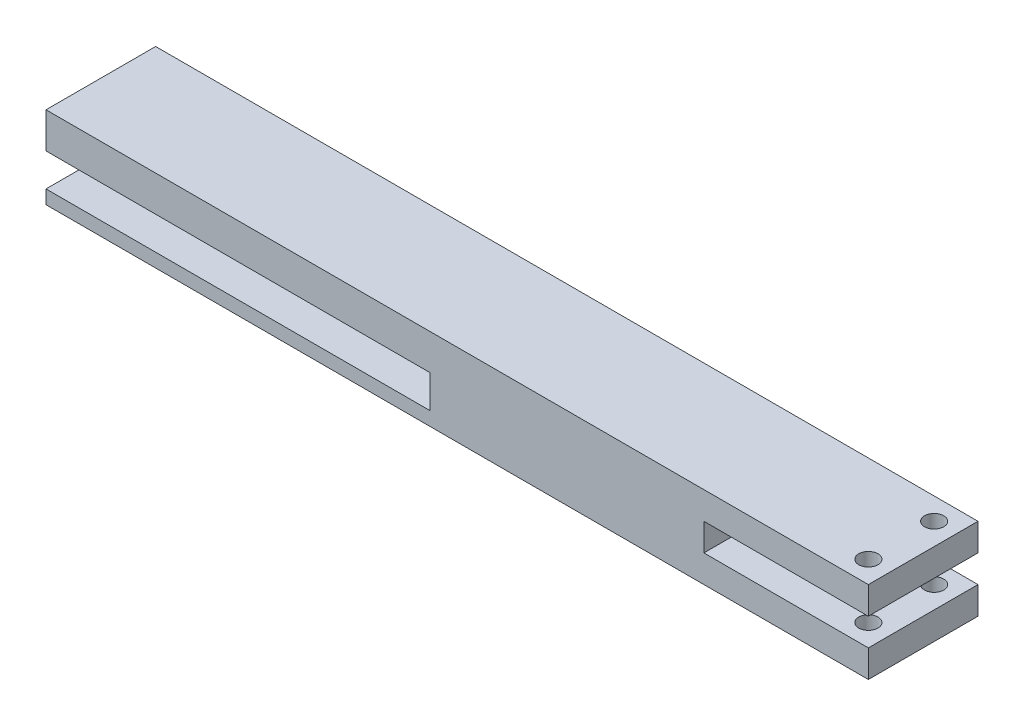
ISO-10303-21;
HEADER;
FILE_DESCRIPTION(('STEP AP214'),'2;1');
FILE_NAME('part.step','',(''),(''),'','','');
FILE_SCHEMA(('AUTOMOTIVE_DESIGN { 1 0 10303 214 1 1 1 1 }'));
ENDSEC;
DATA;
#1=APPLICATION_CONTEXT('core data for automotive mechanical design processes');
#2=APPLICATION_PROTOCOL_DEFINITION('international standard','automotive_design',2000,#1);
#3=PRODUCT_CONTEXT('',#1,'mechanical');
#4=PRODUCT('Part','Part','',(#3));
#5=PRODUCT_RELATED_PRODUCT_CATEGORY('part','',(#4));
#6=PRODUCT_DEFINITION_FORMATION('','',#4);
#7=PRODUCT_DEFINITION_CONTEXT('part definition',#1,'design');
#8=PRODUCT_DEFINITION('design','',#6,#7);
#9=PRODUCT_DEFINITION_SHAPE('','',#8);
#10=(LENGTH_UNIT() NAMED_UNIT(*) SI_UNIT(.MILLI.,.METRE.));
#11=(NAMED_UNIT(*) PLANE_ANGLE_UNIT() SI_UNIT($,.RADIAN.));
#12=(NAMED_UNIT(*) SI_UNIT($,.STERADIAN.) SOLID_ANGLE_UNIT());
#13=UNCERTAINTY_MEASURE_WITH_UNIT(LENGTH_MEASURE(1.E-05),#10,'distance_accuracy_value','');
#14=(GEOMETRIC_REPRESENTATION_CONTEXT(3) GLOBAL_UNCERTAINTY_ASSIGNED_CONTEXT((#13)) GLOBAL_UNIT_ASSIGNED_CONTEXT((#10,
#11,#12)) REPRESENTATION_CONTEXT('',''));
#15=CARTESIAN_POINT('',(0.,0.,0.));
#16=DIRECTION('',(0.,0.,1.));
#17=DIRECTION('',(1.,0.,0.));
#18=AXIS2_PLACEMENT_3D('',#15,#16,#17);
#19=CARTESIAN_POINT('',(68.8,-15.,-10.));
#20=DIRECTION('',(1.,0.,0.));
#21=DIRECTION('',(0.,0.,-1.));
#22=AXIS2_PLACEMENT_3D('',#19,#20,#21);
#23=PLANE('',#22);
#24=DIRECTION('',(0.,0.,1.));
#25=VECTOR('',#24,1.);
#26=CARTESIAN_POINT('',(68.8,-10.,-10.));
#27=LINE('',#26,#25);
#28=CARTESIAN_POINT('',(68.8,-10.,-10.));
#29=VERTEX_POINT('',#28);
#30=CARTESIAN_POINT('',(68.8,-10.,10.));
#31=VERTEX_POINT('',#30);
#32=EDGE_CURVE('E192',#29,#31,#27,.T.);
#33=ORIENTED_EDGE('',*,*,#32,.T.);
#34=DIRECTION('',(0.,1.,0.));
#35=VECTOR('',#34,1.);
#36=CARTESIAN_POINT('',(68.8,-15.,10.));
#37=LINE('',#36,#35);
#38=CARTESIAN_POINT('',(68.8,-15.,10.));
#39=VERTEX_POINT('',#38);
#40=EDGE_CURVE('E149',#39,#31,#37,.T.);
#41=ORIENTED_EDGE('',*,*,#40,.F.);
#42=DIRECTION('',(0.,0.,-1.));
#43=VECTOR('',#42,1.);
#44=CARTESIAN_POINT('',(68.8,-15.,-10.));
#45=LINE('',#44,#43);
#46=CARTESIAN_POINT('',(68.8,-15.,-10.));
#47=VERTEX_POINT('',#46);
#48=EDGE_CURVE('E229',#39,#47,#45,.T.);
#49=ORIENTED_EDGE('',*,*,#48,.T.);
#50=DIRECTION('',(0.,1.,0.));
#51=VECTOR('',#50,1.);
#52=CARTESIAN_POINT('',(68.8,-15.,-10.));
#53=LINE('',#52,#51);
#54=EDGE_CURVE('E148',#47,#29,#53,.T.);
#55=ORIENTED_EDGE('',*,*,#54,.T.);
#56=EDGE_LOOP('',(#33,#41,#49,#55));
#57=FACE_BOUND('',#56,.T.);
#58=ADVANCED_FACE('F33',(#57),#23,.T.);
#59=CARTESIAN_POINT('',(-81.2,-15.,10.));
#60=DIRECTION('',(-1.,0.,0.));
#61=DIRECTION('',(0.,0.,1.));
#62=AXIS2_PLACEMENT_3D('',#59,#60,#61);
#63=PLANE('',#62);
#64=DIRECTION('',(0.,0.,1.));
#65=VECTOR('',#64,1.);
#66=CARTESIAN_POINT('',(-81.2,-6.5,-10.));
#67=LINE('',#66,#65);
#68=CARTESIAN_POINT('',(-81.2,-6.5,-10.));
#69=VERTEX_POINT('',#68);
#70=CARTESIAN_POINT('',(-81.2,-6.5,10.));
#71=VERTEX_POINT('',#70);
#72=EDGE_CURVE('E214',#69,#71,#67,.T.);
#73=ORIENTED_EDGE('',*,*,#72,.T.);
#74=DIRECTION('',(0.,1.,0.));
#75=VECTOR('',#74,1.);
#76=CARTESIAN_POINT('',(-81.2,-15.,10.));
#77=LINE('',#76,#75);
#78=CARTESIAN_POINT('',(-81.2,0.,10.));
#79=VERTEX_POINT('',#78);
#80=EDGE_CURVE('E158',#71,#79,#77,.T.);
#81=ORIENTED_EDGE('',*,*,#80,.T.);
#82=DIRECTION('',(0.,0.,1.));
#83=VECTOR('',#82,1.);
#84=CARTESIAN_POINT('',(-81.2,0.,10.));
#85=LINE('',#84,#83);
#86=CARTESIAN_POINT('',(-81.2,0.,-10.));
#87=VERTEX_POINT('',#86);
#88=EDGE_CURVE('E217',#87,#79,#85,.T.);
#89=ORIENTED_EDGE('',*,*,#88,.F.);
#90=DIRECTION('',(0.,1.,0.));
#91=VECTOR('',#90,1.);
#92=CARTESIAN_POINT('',(-81.2,-15.,-10.));
#93=LINE('',#92,#91);
#94=EDGE_CURVE('E42',#69,#87,#93,.T.);
#95=ORIENTED_EDGE('',*,*,#94,.F.);
#96=EDGE_LOOP('',(#73,#81,#89,#95));
#97=FACE_BOUND('',#96,.T.);
#98=ADVANCED_FACE('F272',(#97),#63,.T.);
#99=DIRECTION('',(0.,0.,1.));
#100=VECTOR('',#99,1.);
#101=CARTESIAN_POINT('',(-81.2,-12.5,-10.));
#102=LINE('',#101,#100);
#103=CARTESIAN_POINT('',(-81.2,-12.5,-10.));
#104=VERTEX_POINT('',#103);
#105=CARTESIAN_POINT('',(-81.2,-12.5,10.));
#106=VERTEX_POINT('',#105);
#107=EDGE_CURVE('E58',#104,#106,#102,.T.);
#108=ORIENTED_EDGE('',*,*,#107,.F.);
#109=CARTESIAN_POINT('',(-81.2,-15.,-10.));
#110=VERTEX_POINT('',#109);
#111=EDGE_CURVE('E11',#110,#104,#93,.T.);
#112=ORIENTED_EDGE('',*,*,#111,.F.);
#113=DIRECTION('',(0.,0.,1.));
#114=VECTOR('',#113,1.);
#115=CARTESIAN_POINT('',(-81.2,-15.,10.));
#116=LINE('',#115,#114);
#117=CARTESIAN_POINT('',(-81.2,-15.,10.));
#118=VERTEX_POINT('',#117);
#119=EDGE_CURVE('E223',#110,#118,#116,.T.);
#120=ORIENTED_EDGE('',*,*,#119,.T.);
#121=EDGE_CURVE('E156',#118,#106,#77,.T.);
#122=ORIENTED_EDGE('',*,*,#121,.T.);
#123=EDGE_LOOP('',(#108,#112,#120,#122));
#124=FACE_BOUND('',#123,.T.);
#125=ADVANCED_FACE('F35',(#124),#63,.T.);
#126=CARTESIAN_POINT('',(-81.2,-15.,-10.));
#127=DIRECTION('',(0.,0.,-1.));
#128=DIRECTION('',(-1.,0.,0.));
#129=AXIS2_PLACEMENT_3D('',#126,#127,#128);
#130=PLANE('',#129);
#131=DIRECTION('',(1.,0.,0.));
#132=VECTOR('',#131,1.);
#133=CARTESIAN_POINT('',(68.8,-10.,-10.));
#134=LINE('',#133,#132);
#135=CARTESIAN_POINT('',(38.8,-10.,-10.));
#136=VERTEX_POINT('',#135);
#137=EDGE_CURVE('E141',#136,#29,#134,.T.);
#138=ORIENTED_EDGE('',*,*,#137,.T.);
#139=ORIENTED_EDGE('',*,*,#54,.F.);
#140=DIRECTION('',(-1.,0.,0.));
#141=VECTOR('',#140,1.);
#142=CARTESIAN_POINT('',(-81.2,-15.,-10.));
#143=LINE('',#142,#141);
#144=EDGE_CURVE('E232',#47,#110,#143,.T.);
#145=ORIENTED_EDGE('',*,*,#144,.T.);
#146=ORIENTED_EDGE('',*,*,#111,.T.);
#147=DIRECTION('',(1.,0.,0.));
#148=VECTOR('',#147,1.);
#149=CARTESIAN_POINT('',(-81.2,-12.5,-10.));
#150=LINE('',#149,#148);
#151=CARTESIAN_POINT('',(-11.2,-12.5,-10.));
#152=VERTEX_POINT('',#151);
#153=EDGE_CURVE('E199',#104,#152,#150,.T.);
#154=ORIENTED_EDGE('',*,*,#153,.T.);
#155=DIRECTION('',(0.,1.,0.));
#156=VECTOR('',#155,1.);
#157=CARTESIAN_POINT('',(-11.2,-6.5,-10.));
#158=LINE('',#157,#156);
#159=CARTESIAN_POINT('',(-11.2,-6.5,-10.));
#160=VERTEX_POINT('',#159);
#161=EDGE_CURVE('E202',#152,#160,#158,.T.);
#162=ORIENTED_EDGE('',*,*,#161,.T.);
#163=DIRECTION('',(-1.,0.,0.));
#164=VECTOR('',#163,1.);
#165=CARTESIAN_POINT('',(-81.2,-6.5,-10.));
#166=LINE('',#165,#164);
#167=EDGE_CURVE('E206',#160,#69,#166,.T.);
#168=ORIENTED_EDGE('',*,*,#167,.T.);
#169=ORIENTED_EDGE('',*,*,#94,.T.);
#170=DIRECTION('',(-1.,0.,0.));
#171=VECTOR('',#170,1.);
#172=CARTESIAN_POINT('',(-81.2,0.,-10.));
#173=LINE('',#172,#171);
#174=CARTESIAN_POINT('',(68.8,0.,-10.));
#175=VERTEX_POINT('',#174);
#176=EDGE_CURVE('E147',#175,#87,#173,.T.);
#177=ORIENTED_EDGE('',*,*,#176,.F.);
#178=CARTESIAN_POINT('',(68.8,-5.,-10.));
#179=VERTEX_POINT('',#178);
#180=EDGE_CURVE('E138',#179,#175,#53,.T.);
#181=ORIENTED_EDGE('',*,*,#180,.F.);
#182=DIRECTION('',(-1.,0.,0.));
#183=VECTOR('',#182,1.);
#184=CARTESIAN_POINT('',(68.8,-5.,-10.));
#185=LINE('',#184,#183);
#186=CARTESIAN_POINT('',(38.8,-5.,-10.));
#187=VERTEX_POINT('',#186);
#188=EDGE_CURVE('E124',#179,#187,#185,.T.);
#189=ORIENTED_EDGE('',*,*,#188,.T.);
#190=DIRECTION('',(0.,-1.,0.));
#191=VECTOR('',#190,1.);
#192=CARTESIAN_POINT('',(38.8,-5.,-10.));
#193=LINE('',#192,#191);
#194=EDGE_CURVE('E131',#187,#136,#193,.T.);
#195=ORIENTED_EDGE('',*,*,#194,.T.);
#196=EDGE_LOOP('',(#138,#139,#145,#146,#154,#162,#168,#169,#177,#181,#189,#195));
#197=FACE_BOUND('',#196,.T.);
#198=ADVANCED_FACE('F145',(#197),#130,.T.);
#199=DIRECTION('',(0.,0.,1.));
#200=VECTOR('',#199,1.);
#201=CARTESIAN_POINT('',(68.8,-5.,-10.));
#202=LINE('',#201,#200);
#203=CARTESIAN_POINT('',(68.8,-5.,10.));
#204=VERTEX_POINT('',#203);
#205=EDGE_CURVE('E50',#179,#204,#202,.T.);
#206=ORIENTED_EDGE('',*,*,#205,.F.);
#207=ORIENTED_EDGE('',*,*,#180,.T.);
#208=DIRECTION('',(0.,0.,-1.));
#209=VECTOR('',#208,1.);
#210=CARTESIAN_POINT('',(68.8,0.,-10.));
#211=LINE('',#210,#209);
#212=CARTESIAN_POINT('',(68.8,0.,10.));
#213=VERTEX_POINT('',#212);
#214=EDGE_CURVE('E240',#213,#175,#211,.T.);
#215=ORIENTED_EDGE('',*,*,#214,.F.);
#216=EDGE_CURVE('E140',#204,#213,#37,.T.);
#217=ORIENTED_EDGE('',*,*,#216,.F.);
#218=EDGE_LOOP('',(#206,#207,#215,#217));
#219=FACE_BOUND('',#218,.T.);
#220=ADVANCED_FACE('F136',(#219),#23,.T.);
#221=CARTESIAN_POINT('',(68.8,-15.,10.));
#222=DIRECTION('',(0.,0.,1.));
#223=DIRECTION('',(1.,0.,0.));
#224=AXIS2_PLACEMENT_3D('',#221,#222,#223);
#225=PLANE('',#224);
#226=DIRECTION('',(1.,0.,0.));
#227=VECTOR('',#226,1.);
#228=CARTESIAN_POINT('',(68.8,-10.,10.));
#229=LINE('',#228,#227);
#230=CARTESIAN_POINT('',(38.8,-10.,10.));
#231=VERTEX_POINT('',#230);
#232=EDGE_CURVE('E132',#231,#31,#229,.T.);
#233=ORIENTED_EDGE('',*,*,#232,.F.);
#234=DIRECTION('',(0.,-1.,0.));
#235=VECTOR('',#234,1.);
#236=CARTESIAN_POINT('',(38.8,-5.,10.));
#237=LINE('',#236,#235);
#238=CARTESIAN_POINT('',(38.8,-5.,10.));
#239=VERTEX_POINT('',#238);
#240=EDGE_CURVE('E188',#239,#231,#237,.T.);
#241=ORIENTED_EDGE('',*,*,#240,.F.);
#242=DIRECTION('',(-1.,0.,0.));
#243=VECTOR('',#242,1.);
#244=CARTESIAN_POINT('',(68.8,-5.,10.));
#245=LINE('',#244,#243);
#246=EDGE_CURVE('E183',#204,#239,#245,.T.);
#247=ORIENTED_EDGE('',*,*,#246,.F.);
#248=ORIENTED_EDGE('',*,*,#216,.T.);
#249=DIRECTION('',(1.,0.,0.));
#250=VECTOR('',#249,1.);
#251=CARTESIAN_POINT('',(68.8,0.,10.));
#252=LINE('',#251,#250);
#253=EDGE_CURVE('E237',#79,#213,#252,.T.);
#254=ORIENTED_EDGE('',*,*,#253,.F.);
#255=ORIENTED_EDGE('',*,*,#80,.F.);
#256=DIRECTION('',(-1.,0.,0.));
#257=VECTOR('',#256,1.);
#258=CARTESIAN_POINT('',(-81.2,-6.5,10.));
#259=LINE('',#258,#257);
#260=CARTESIAN_POINT('',(-11.2,-6.5,10.));
#261=VERTEX_POINT('',#260);
#262=EDGE_CURVE('E203',#261,#71,#259,.T.);
#263=ORIENTED_EDGE('',*,*,#262,.F.);
#264=DIRECTION('',(0.,1.,0.));
#265=VECTOR('',#264,1.);
#266=CARTESIAN_POINT('',(-11.2,-6.5,10.));
#267=LINE('',#266,#265);
#268=CARTESIAN_POINT('',(-11.2,-12.5,10.));
#269=VERTEX_POINT('',#268);
#270=EDGE_CURVE('E210',#269,#261,#267,.T.);
#271=ORIENTED_EDGE('',*,*,#270,.F.);
#272=DIRECTION('',(1.,0.,0.));
#273=VECTOR('',#272,1.);
#274=CARTESIAN_POINT('',(-81.2,-12.5,10.));
#275=LINE('',#274,#273);
#276=EDGE_CURVE('E195',#106,#269,#275,.T.);
#277=ORIENTED_EDGE('',*,*,#276,.F.);
#278=ORIENTED_EDGE('',*,*,#121,.F.);
#279=DIRECTION('',(1.,0.,0.));
#280=VECTOR('',#279,1.);
#281=CARTESIAN_POINT('',(68.8,-15.,10.));
#282=LINE('',#281,#280);
#283=EDGE_CURVE('E226',#118,#39,#282,.T.);
#284=ORIENTED_EDGE('',*,*,#283,.T.);
#285=ORIENTED_EDGE('',*,*,#40,.T.);
#286=EDGE_LOOP('',(#233,#241,#247,#248,#254,#255,#263,#271,#277,#278,#284,#285));
#287=FACE_BOUND('',#286,.T.);
#288=ADVANCED_FACE('F248',(#287),#225,.T.);
#289=CARTESIAN_POINT('',(0.,-15.,0.));
#290=DIRECTION('',(0.,-1.,0.));
#291=DIRECTION('',(0.,0.,-1.));
#292=AXIS2_PLACEMENT_3D('',#289,#290,#291);
#293=PLANE('',#292);
#294=CARTESIAN_POINT('',(64.8,-15.,6.00000000000002));
#295=DIRECTION('',(0.,1.,0.));
#296=DIRECTION('',(0.,0.,1.));
#297=AXIS2_PLACEMENT_3D('',#294,#295,#296);
#298=CIRCLE('',#297,1.75);
#299=CARTESIAN_POINT('',(64.8,-15.,7.75000000000002));
#300=VERTEX_POINT('',#299);
#301=EDGE_CURVE('E162',#300,#300,#298,.T.);
#302=ORIENTED_EDGE('',*,*,#301,.T.);
#303=EDGE_LOOP('',(#302));
#304=FACE_BOUND('',#303,.T.);
#305=CARTESIAN_POINT('',(64.8,-15.,-6.));
#306=DIRECTION('',(0.,1.,0.));
#307=DIRECTION('',(0.,0.,1.));
#308=AXIS2_PLACEMENT_3D('',#305,#306,#307);
#309=CIRCLE('',#308,1.75);
#310=CARTESIAN_POINT('',(64.8,-15.,-4.25));
#311=VERTEX_POINT('',#310);
#312=EDGE_CURVE('E173',#311,#311,#309,.T.);
#313=ORIENTED_EDGE('',*,*,#312,.T.);
#314=EDGE_LOOP('',(#313));
#315=FACE_BOUND('',#314,.T.);
#316=ORIENTED_EDGE('',*,*,#119,.F.);
#317=ORIENTED_EDGE('',*,*,#144,.F.);
#318=ORIENTED_EDGE('',*,*,#48,.F.);
#319=ORIENTED_EDGE('',*,*,#283,.F.);
#320=EDGE_LOOP('',(#316,#317,#318,#319));
#321=FACE_BOUND('',#320,.T.);
#322=ADVANCED_FACE('F261',(#304,#315,#321),#293,.T.);
#323=CARTESIAN_POINT('',(0.,0.,0.));
#324=DIRECTION('',(0.,-1.,0.));
#325=DIRECTION('',(0.,0.,-1.));
#326=AXIS2_PLACEMENT_3D('',#323,#324,#325);
#327=PLANE('',#326);
#328=CARTESIAN_POINT('',(64.8,0.,6.00000000000002));
#329=DIRECTION('',(0.,1.,0.));
#330=DIRECTION('',(0.,0.,1.));
#331=AXIS2_PLACEMENT_3D('',#328,#329,#330);
#332=CIRCLE('',#331,1.75);
#333=CARTESIAN_POINT('',(64.8,0.,7.75000000000002));
#334=VERTEX_POINT('',#333);
#335=EDGE_CURVE('E168',#334,#334,#332,.T.);
#336=ORIENTED_EDGE('',*,*,#335,.F.);
#337=EDGE_LOOP('',(#336));
#338=FACE_BOUND('',#337,.T.);
#339=CARTESIAN_POINT('',(64.8,0.,-6.));
#340=DIRECTION('',(0.,1.,0.));
#341=DIRECTION('',(0.,0.,1.));
#342=AXIS2_PLACEMENT_3D('',#339,#340,#341);
#343=CIRCLE('',#342,1.75);
#344=CARTESIAN_POINT('',(64.8,0.,-4.25));
#345=VERTEX_POINT('',#344);
#346=EDGE_CURVE('E178',#345,#345,#343,.T.);
#347=ORIENTED_EDGE('',*,*,#346,.F.);
#348=EDGE_LOOP('',(#347));
#349=FACE_BOUND('',#348,.T.);
#350=ORIENTED_EDGE('',*,*,#88,.T.);
#351=ORIENTED_EDGE('',*,*,#253,.T.);
#352=ORIENTED_EDGE('',*,*,#214,.T.);
#353=ORIENTED_EDGE('',*,*,#176,.T.);
#354=EDGE_LOOP('',(#350,#351,#352,#353));
#355=FACE_BOUND('',#354,.T.);
#356=ADVANCED_FACE('F242',(#338,#349,#355),#327,.F.);
#357=CARTESIAN_POINT('',(-81.2,-6.5,-10.));
#358=DIRECTION('',(0.,1.,0.));
#359=DIRECTION('',(-1.,0.,0.));
#360=AXIS2_PLACEMENT_3D('',#357,#358,#359);
#361=PLANE('',#360);
#362=ORIENTED_EDGE('',*,*,#262,.T.);
#363=ORIENTED_EDGE('',*,*,#72,.F.);
#364=ORIENTED_EDGE('',*,*,#167,.F.);
#365=DIRECTION('',(0.,0.,1.));
#366=VECTOR('',#365,1.);
#367=CARTESIAN_POINT('',(-11.2,-6.5,-10.));
#368=LINE('',#367,#366);
#369=EDGE_CURVE('E218',#160,#261,#368,.T.);
#370=ORIENTED_EDGE('',*,*,#369,.T.);
#371=EDGE_LOOP('',(#362,#363,#364,#370));
#372=FACE_BOUND('',#371,.T.);
#373=ADVANCED_FACE('F273',(#372),#361,.F.);
#374=CARTESIAN_POINT('',(-11.2,-6.5,-10.));
#375=DIRECTION('',(1.,0.,0.));
#376=DIRECTION('',(0.,0.,-1.));
#377=AXIS2_PLACEMENT_3D('',#374,#375,#376);
#378=PLANE('',#377);
#379=ORIENTED_EDGE('',*,*,#270,.T.);
#380=ORIENTED_EDGE('',*,*,#369,.F.);
#381=ORIENTED_EDGE('',*,*,#161,.F.);
#382=DIRECTION('',(0.,0.,1.));
#383=VECTOR('',#382,1.);
#384=CARTESIAN_POINT('',(-11.2,-12.5,-10.));
#385=LINE('',#384,#383);
#386=EDGE_CURVE('E220',#152,#269,#385,.T.);
#387=ORIENTED_EDGE('',*,*,#386,.T.);
#388=EDGE_LOOP('',(#379,#380,#381,#387));
#389=FACE_BOUND('',#388,.T.);
#390=ADVANCED_FACE('F267',(#389),#378,.F.);
#391=CARTESIAN_POINT('',(-81.2,-12.5,-10.));
#392=DIRECTION('',(0.,-1.,0.));
#393=DIRECTION('',(0.,0.,-1.));
#394=AXIS2_PLACEMENT_3D('',#391,#392,#393);
#395=PLANE('',#394);
#396=ORIENTED_EDGE('',*,*,#276,.T.);
#397=ORIENTED_EDGE('',*,*,#386,.F.);
#398=ORIENTED_EDGE('',*,*,#153,.F.);
#399=ORIENTED_EDGE('',*,*,#107,.T.);
#400=EDGE_LOOP('',(#396,#397,#398,#399));
#401=FACE_BOUND('',#400,.T.);
#402=ADVANCED_FACE('F264',(#401),#395,.F.);
#403=CARTESIAN_POINT('',(68.8,-10.,-10.));
#404=DIRECTION('',(0.,-1.,0.));
#405=DIRECTION('',(1.,0.,0.));
#406=AXIS2_PLACEMENT_3D('',#403,#404,#405);
#407=PLANE('',#406);
#408=CARTESIAN_POINT('',(64.8,-10.,6.00000000000002));
#409=DIRECTION('',(0.,-1.,0.));
#410=DIRECTION('',(1.,0.,0.));
#411=AXIS2_PLACEMENT_3D('',#408,#409,#410);
#412=CIRCLE('',#411,1.75);
#413=CARTESIAN_POINT('',(66.55,-10.,6.00000000000002));
#414=VERTEX_POINT('',#413);
#415=EDGE_CURVE('E181',#414,#414,#412,.T.);
#416=ORIENTED_EDGE('',*,*,#415,.T.);
#417=EDGE_LOOP('',(#416));
#418=FACE_BOUND('',#417,.T.);
#419=CARTESIAN_POINT('',(64.8,-10.,-6.));
#420=DIRECTION('',(0.,-1.,0.));
#421=DIRECTION('',(1.,0.,0.));
#422=AXIS2_PLACEMENT_3D('',#419,#420,#421);
#423=CIRCLE('',#422,1.75);
#424=CARTESIAN_POINT('',(66.55,-10.,-6.));
#425=VERTEX_POINT('',#424);
#426=EDGE_CURVE('E161',#425,#425,#423,.T.);
#427=ORIENTED_EDGE('',*,*,#426,.T.);
#428=EDGE_LOOP('',(#427));
#429=FACE_BOUND('',#428,.T.);
#430=ORIENTED_EDGE('',*,*,#232,.T.);
#431=ORIENTED_EDGE('',*,*,#32,.F.);
#432=ORIENTED_EDGE('',*,*,#137,.F.);
#433=DIRECTION('',(0.,0.,1.));
#434=VECTOR('',#433,1.);
#435=CARTESIAN_POINT('',(38.8,-10.,-10.));
#436=LINE('',#435,#434);
#437=EDGE_CURVE('E196',#136,#231,#436,.T.);
#438=ORIENTED_EDGE('',*,*,#437,.T.);
#439=EDGE_LOOP('',(#430,#431,#432,#438));
#440=FACE_BOUND('',#439,.T.);
#441=ADVANCED_FACE('F302',(#418,#429,#440),#407,.F.);
#442=CARTESIAN_POINT('',(38.8,-5.,-10.));
#443=DIRECTION('',(-1.,0.,0.));
#444=DIRECTION('',(0.,0.,1.));
#445=AXIS2_PLACEMENT_3D('',#442,#443,#444);
#446=PLANE('',#445);
#447=ORIENTED_EDGE('',*,*,#240,.T.);
#448=ORIENTED_EDGE('',*,*,#437,.F.);
#449=ORIENTED_EDGE('',*,*,#194,.F.);
#450=DIRECTION('',(0.,0.,1.));
#451=VECTOR('',#450,1.);
#452=CARTESIAN_POINT('',(38.8,-5.,-10.));
#453=LINE('',#452,#451);
#454=EDGE_CURVE('E126',#187,#239,#453,.T.);
#455=ORIENTED_EDGE('',*,*,#454,.T.);
#456=EDGE_LOOP('',(#447,#448,#449,#455));
#457=FACE_BOUND('',#456,.T.);
#458=ADVANCED_FACE('F252',(#457),#446,.F.);
#459=CARTESIAN_POINT('',(68.8,-5.,-10.));
#460=DIRECTION('',(0.,1.,0.));
#461=DIRECTION('',(-1.,0.,0.));
#462=AXIS2_PLACEMENT_3D('',#459,#460,#461);
#463=PLANE('',#462);
#464=CARTESIAN_POINT('',(64.8,-5.,6.00000000000002));
#465=DIRECTION('',(0.,1.,0.));
#466=DIRECTION('',(-1.,0.,0.));
#467=AXIS2_PLACEMENT_3D('',#464,#465,#466);
#468=CIRCLE('',#467,1.75);
#469=CARTESIAN_POINT('',(63.05,-5.,6.00000000000002));
#470=VERTEX_POINT('',#469);
#471=EDGE_CURVE('E37',#470,#470,#468,.T.);
#472=ORIENTED_EDGE('',*,*,#471,.T.);
#473=EDGE_LOOP('',(#472));
#474=FACE_BOUND('',#473,.T.);
#475=CARTESIAN_POINT('',(64.8,-5.,-6.));
#476=DIRECTION('',(0.,1.,0.));
#477=DIRECTION('',(-1.,0.,0.));
#478=AXIS2_PLACEMENT_3D('',#475,#476,#477);
#479=CIRCLE('',#478,1.75);
#480=CARTESIAN_POINT('',(63.05,-5.,-6.));
#481=VERTEX_POINT('',#480);
#482=EDGE_CURVE('E159',#481,#481,#479,.T.);
#483=ORIENTED_EDGE('',*,*,#482,.T.);
#484=EDGE_LOOP('',(#483));
#485=FACE_BOUND('',#484,.T.);
#486=ORIENTED_EDGE('',*,*,#246,.T.);
#487=ORIENTED_EDGE('',*,*,#454,.F.);
#488=ORIENTED_EDGE('',*,*,#188,.F.);
#489=ORIENTED_EDGE('',*,*,#205,.T.);
#490=EDGE_LOOP('',(#486,#487,#488,#489));
#491=FACE_BOUND('',#490,.T.);
#492=ADVANCED_FACE('F125',(#474,#485,#491),#463,.F.);
#493=CARTESIAN_POINT('',(64.8,-15.,-6.));
#494=DIRECTION('',(0.,1.,0.));
#495=DIRECTION('',(0.,0.,1.));
#496=AXIS2_PLACEMENT_3D('',#493,#494,#495);
#497=CYLINDRICAL_SURFACE('',#496,1.75);
#498=ORIENTED_EDGE('',*,*,#346,.T.);
#499=EDGE_LOOP('',(#498));
#500=FACE_BOUND('',#499,.T.);
#501=ORIENTED_EDGE('',*,*,#482,.F.);
#502=EDGE_LOOP('',(#501));
#503=FACE_BOUND('',#502,.T.);
#504=ADVANCED_FACE('F317',(#500,#503),#497,.F.);
#505=CARTESIAN_POINT('',(64.8,-15.,6.00000000000002));
#506=DIRECTION('',(0.,1.,0.));
#507=DIRECTION('',(0.,0.,1.));
#508=AXIS2_PLACEMENT_3D('',#505,#506,#507);
#509=CYLINDRICAL_SURFACE('',#508,1.75);
#510=ORIENTED_EDGE('',*,*,#335,.T.);
#511=EDGE_LOOP('',(#510));
#512=FACE_BOUND('',#511,.T.);
#513=ORIENTED_EDGE('',*,*,#471,.F.);
#514=EDGE_LOOP('',(#513));
#515=FACE_BOUND('',#514,.T.);
#516=ADVANCED_FACE('F322',(#512,#515),#509,.F.);
#517=ORIENTED_EDGE('',*,*,#312,.F.);
#518=EDGE_LOOP('',(#517));
#519=FACE_BOUND('',#518,.T.);
#520=ORIENTED_EDGE('',*,*,#426,.F.);
#521=EDGE_LOOP('',(#520));
#522=FACE_BOUND('',#521,.T.);
#523=ADVANCED_FACE('F314',(#519,#522),#497,.F.);
#524=ORIENTED_EDGE('',*,*,#301,.F.);
#525=EDGE_LOOP('',(#524));
#526=FACE_BOUND('',#525,.T.);
#527=ORIENTED_EDGE('',*,*,#415,.F.);
#528=EDGE_LOOP('',(#527));
#529=FACE_BOUND('',#528,.T.);
#530=ADVANCED_FACE('F329',(#526,#529),#509,.F.);
#531=CLOSED_SHELL('',(#58,#98,#125,#198,#220,#288,#322,#356,#373,#390,#402,#441,#458,#492,#504,
#516,#523,#530));
#532=MANIFOLD_SOLID_BREP('B2',#531);
#533=ADVANCED_BREP_SHAPE_REPRESENTATION('',(#18,#532),#14);
#534=SHAPE_DEFINITION_REPRESENTATION(#9,#533);
ENDSEC;
END-ISO-10303-21;
